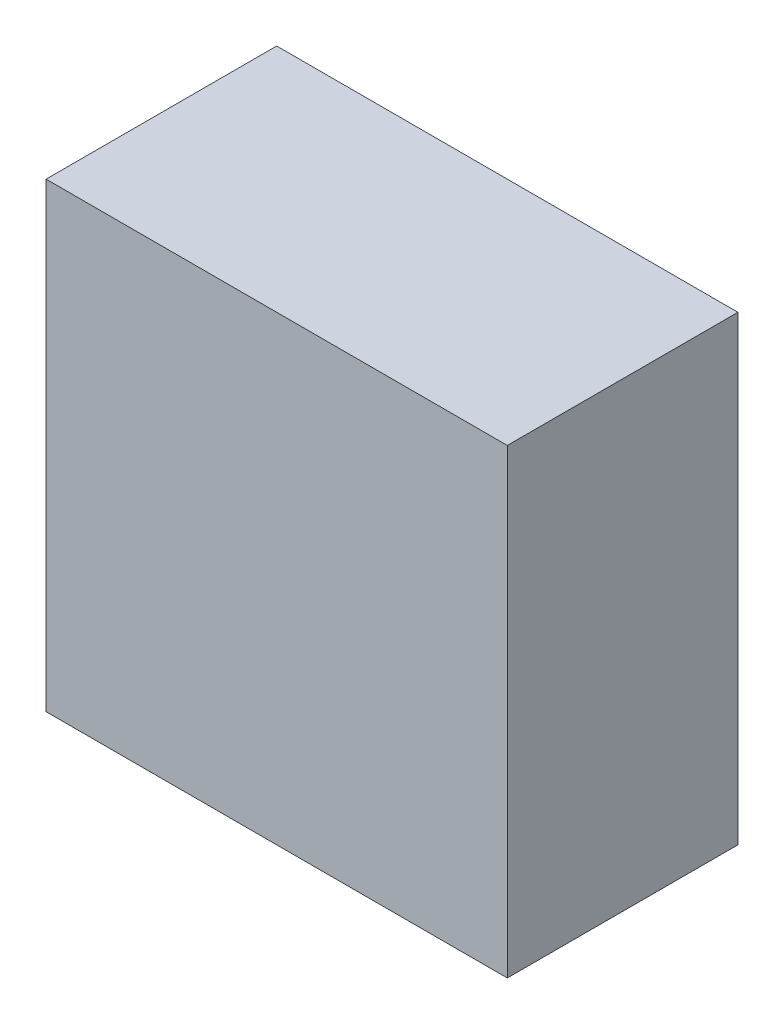
ISO-10303-21;
HEADER;
FILE_DESCRIPTION(('STEP AP214'),'2;1');
FILE_NAME('part.step','',(''),(''),'','','');
FILE_SCHEMA(('AUTOMOTIVE_DESIGN { 1 0 10303 214 1 1 1 1 }'));
ENDSEC;
DATA;
#1=APPLICATION_CONTEXT('core data for automotive mechanical design processes');
#2=APPLICATION_PROTOCOL_DEFINITION('international standard','automotive_design',2000,#1);
#3=PRODUCT_CONTEXT('',#1,'mechanical');
#4=PRODUCT('Part','Part','',(#3));
#5=PRODUCT_RELATED_PRODUCT_CATEGORY('part','',(#4));
#6=PRODUCT_DEFINITION_FORMATION('','',#4);
#7=PRODUCT_DEFINITION_CONTEXT('part definition',#1,'design');
#8=PRODUCT_DEFINITION('design','',#6,#7);
#9=PRODUCT_DEFINITION_SHAPE('','',#8);
#10=(LENGTH_UNIT() NAMED_UNIT(*) SI_UNIT(.MILLI.,.METRE.));
#11=(NAMED_UNIT(*) PLANE_ANGLE_UNIT() SI_UNIT($,.RADIAN.));
#12=(NAMED_UNIT(*) SI_UNIT($,.STERADIAN.) SOLID_ANGLE_UNIT());
#13=UNCERTAINTY_MEASURE_WITH_UNIT(LENGTH_MEASURE(1.E-05),#10,'distance_accuracy_value','');
#14=(GEOMETRIC_REPRESENTATION_CONTEXT(3) GLOBAL_UNCERTAINTY_ASSIGNED_CONTEXT((#13)) GLOBAL_UNIT_ASSIGNED_CONTEXT((#10,
#11,#12)) REPRESENTATION_CONTEXT('',''));
#15=CARTESIAN_POINT('',(0.,0.,0.));
#16=DIRECTION('',(0.,0.,1.));
#17=DIRECTION('',(1.,0.,0.));
#18=AXIS2_PLACEMENT_3D('',#15,#16,#17);
#19=CARTESIAN_POINT('',(0.,0.,-20000.));
#20=DIRECTION('',(-1.,0.,0.));
#21=DIRECTION('',(0.,0.,1.));
#22=AXIS2_PLACEMENT_3D('',#19,#20,#21);
#23=PLANE('',#22);
#24=DIRECTION('',(0.,-1.,0.));
#25=VECTOR('',#24,1.);
#26=CARTESIAN_POINT('',(0.,0.,0.));
#27=LINE('',#26,#25);
#28=CARTESIAN_POINT('',(0.,40000.,0.));
#29=VERTEX_POINT('',#28);
#30=CARTESIAN_POINT('',(0.,0.,0.));
#31=VERTEX_POINT('',#30);
#32=EDGE_CURVE('E104',#29,#31,#27,.T.);
#33=ORIENTED_EDGE('',*,*,#32,.F.);
#34=DIRECTION('',(0.,0.,1.));
#35=VECTOR('',#34,1.);
#36=CARTESIAN_POINT('',(0.,40000.,-20000.));
#37=LINE('',#36,#35);
#38=CARTESIAN_POINT('',(0.,40000.,-20000.));
#39=VERTEX_POINT('',#38);
#40=EDGE_CURVE('E11',#39,#29,#37,.T.);
#41=ORIENTED_EDGE('',*,*,#40,.F.);
#42=DIRECTION('',(0.,-1.,0.));
#43=VECTOR('',#42,1.);
#44=CARTESIAN_POINT('',(0.,0.,-20000.));
#45=LINE('',#44,#43);
#46=CARTESIAN_POINT('',(0.,0.,-20000.));
#47=VERTEX_POINT('',#46);
#48=EDGE_CURVE('E97',#39,#47,#45,.T.);
#49=ORIENTED_EDGE('',*,*,#48,.T.);
#50=DIRECTION('',(0.,0.,1.));
#51=VECTOR('',#50,1.);
#52=CARTESIAN_POINT('',(0.,0.,-20000.));
#53=LINE('',#52,#51);
#54=EDGE_CURVE('E42',#47,#31,#53,.T.);
#55=ORIENTED_EDGE('',*,*,#54,.T.);
#56=EDGE_LOOP('',(#33,#41,#49,#55));
#57=FACE_BOUND('',#56,.T.);
#58=ADVANCED_FACE('F41',(#57),#23,.T.);
#59=CARTESIAN_POINT('',(0.,40000.,-20000.));
#60=DIRECTION('',(0.,1.,0.));
#61=DIRECTION('',(0.,0.,1.));
#62=AXIS2_PLACEMENT_3D('',#59,#60,#61);
#63=PLANE('',#62);
#64=DIRECTION('',(-1.,0.,0.));
#65=VECTOR('',#64,1.);
#66=CARTESIAN_POINT('',(0.,40000.,0.));
#67=LINE('',#66,#65);
#68=CARTESIAN_POINT('',(40000.,40000.,0.));
#69=VERTEX_POINT('',#68);
#70=EDGE_CURVE('E101',#69,#29,#67,.T.);
#71=ORIENTED_EDGE('',*,*,#70,.F.);
#72=DIRECTION('',(0.,0.,1.));
#73=VECTOR('',#72,1.);
#74=CARTESIAN_POINT('',(40000.,40000.,-20000.));
#75=LINE('',#74,#73);
#76=CARTESIAN_POINT('',(40000.,40000.,-20000.));
#77=VERTEX_POINT('',#76);
#78=EDGE_CURVE('E49',#77,#69,#75,.T.);
#79=ORIENTED_EDGE('',*,*,#78,.F.);
#80=DIRECTION('',(-1.,0.,0.));
#81=VECTOR('',#80,1.);
#82=CARTESIAN_POINT('',(0.,40000.,-20000.));
#83=LINE('',#82,#81);
#84=EDGE_CURVE('E96',#77,#39,#83,.T.);
#85=ORIENTED_EDGE('',*,*,#84,.T.);
#86=ORIENTED_EDGE('',*,*,#40,.T.);
#87=EDGE_LOOP('',(#71,#79,#85,#86));
#88=FACE_BOUND('',#87,.T.);
#89=ADVANCED_FACE('F113',(#88),#63,.T.);
#90=CARTESIAN_POINT('',(40000.,0.,-20000.));
#91=DIRECTION('',(1.,0.,0.));
#92=DIRECTION('',(0.,0.,-1.));
#93=AXIS2_PLACEMENT_3D('',#90,#91,#92);
#94=PLANE('',#93);
#95=DIRECTION('',(0.,1.,0.));
#96=VECTOR('',#95,1.);
#97=CARTESIAN_POINT('',(40000.,0.,0.));
#98=LINE('',#97,#96);
#99=CARTESIAN_POINT('',(40000.,0.,0.));
#100=VERTEX_POINT('',#99);
#101=EDGE_CURVE('E93',#100,#69,#98,.T.);
#102=ORIENTED_EDGE('',*,*,#101,.F.);
#103=DIRECTION('',(0.,0.,1.));
#104=VECTOR('',#103,1.);
#105=CARTESIAN_POINT('',(40000.,0.,-20000.));
#106=LINE('',#105,#104);
#107=CARTESIAN_POINT('',(40000.,0.,-20000.));
#108=VERTEX_POINT('',#107);
#109=EDGE_CURVE('E88',#108,#100,#106,.T.);
#110=ORIENTED_EDGE('',*,*,#109,.F.);
#111=DIRECTION('',(0.,1.,0.));
#112=VECTOR('',#111,1.);
#113=CARTESIAN_POINT('',(40000.,0.,-20000.));
#114=LINE('',#113,#112);
#115=EDGE_CURVE('E90',#108,#77,#114,.T.);
#116=ORIENTED_EDGE('',*,*,#115,.T.);
#117=ORIENTED_EDGE('',*,*,#78,.T.);
#118=EDGE_LOOP('',(#102,#110,#116,#117));
#119=FACE_BOUND('',#118,.T.);
#120=ADVANCED_FACE('F86',(#119),#94,.T.);
#121=CARTESIAN_POINT('',(0.,0.,-20000.));
#122=DIRECTION('',(0.,-1.,0.));
#123=DIRECTION('',(0.,0.,-1.));
#124=AXIS2_PLACEMENT_3D('',#121,#122,#123);
#125=PLANE('',#124);
#126=DIRECTION('',(1.,0.,0.));
#127=VECTOR('',#126,1.);
#128=CARTESIAN_POINT('',(0.,0.,0.));
#129=LINE('',#128,#127);
#130=EDGE_CURVE('E107',#31,#100,#129,.T.);
#131=ORIENTED_EDGE('',*,*,#130,.F.);
#132=ORIENTED_EDGE('',*,*,#54,.F.);
#133=DIRECTION('',(1.,0.,0.));
#134=VECTOR('',#133,1.);
#135=CARTESIAN_POINT('',(0.,0.,-20000.));
#136=LINE('',#135,#134);
#137=EDGE_CURVE('E92',#47,#108,#136,.T.);
#138=ORIENTED_EDGE('',*,*,#137,.T.);
#139=ORIENTED_EDGE('',*,*,#109,.T.);
#140=EDGE_LOOP('',(#131,#132,#138,#139));
#141=FACE_BOUND('',#140,.T.);
#142=ADVANCED_FACE('F98',(#141),#125,.T.);
#143=CARTESIAN_POINT('',(0.,0.,-20000.));
#144=DIRECTION('',(0.,0.,-1.));
#145=DIRECTION('',(-1.,0.,0.));
#146=AXIS2_PLACEMENT_3D('',#143,#144,#145);
#147=PLANE('',#146);
#148=ORIENTED_EDGE('',*,*,#48,.F.);
#149=ORIENTED_EDGE('',*,*,#84,.F.);
#150=ORIENTED_EDGE('',*,*,#115,.F.);
#151=ORIENTED_EDGE('',*,*,#137,.F.);
#152=EDGE_LOOP('',(#148,#149,#150,#151));
#153=FACE_BOUND('',#152,.T.);
#154=ADVANCED_FACE('F94',(#153),#147,.T.);
#155=CARTESIAN_POINT('',(0.,0.,0.));
#156=DIRECTION('',(0.,0.,-1.));
#157=DIRECTION('',(-1.,0.,0.));
#158=AXIS2_PLACEMENT_3D('',#155,#156,#157);
#159=PLANE('',#158);
#160=ORIENTED_EDGE('',*,*,#32,.T.);
#161=ORIENTED_EDGE('',*,*,#130,.T.);
#162=ORIENTED_EDGE('',*,*,#101,.T.);
#163=ORIENTED_EDGE('',*,*,#70,.T.);
#164=EDGE_LOOP('',(#160,#161,#162,#163));
#165=FACE_BOUND('',#164,.T.);
#166=ADVANCED_FACE('F111',(#165),#159,.F.);
#167=CLOSED_SHELL('',(#58,#89,#120,#142,#154,#166));
#168=MANIFOLD_SOLID_BREP('B2',#167);
#169=ADVANCED_BREP_SHAPE_REPRESENTATION('',(#18,#168),#14);
#170=SHAPE_DEFINITION_REPRESENTATION(#9,#169);
ENDSEC;
END-ISO-10303-21;
